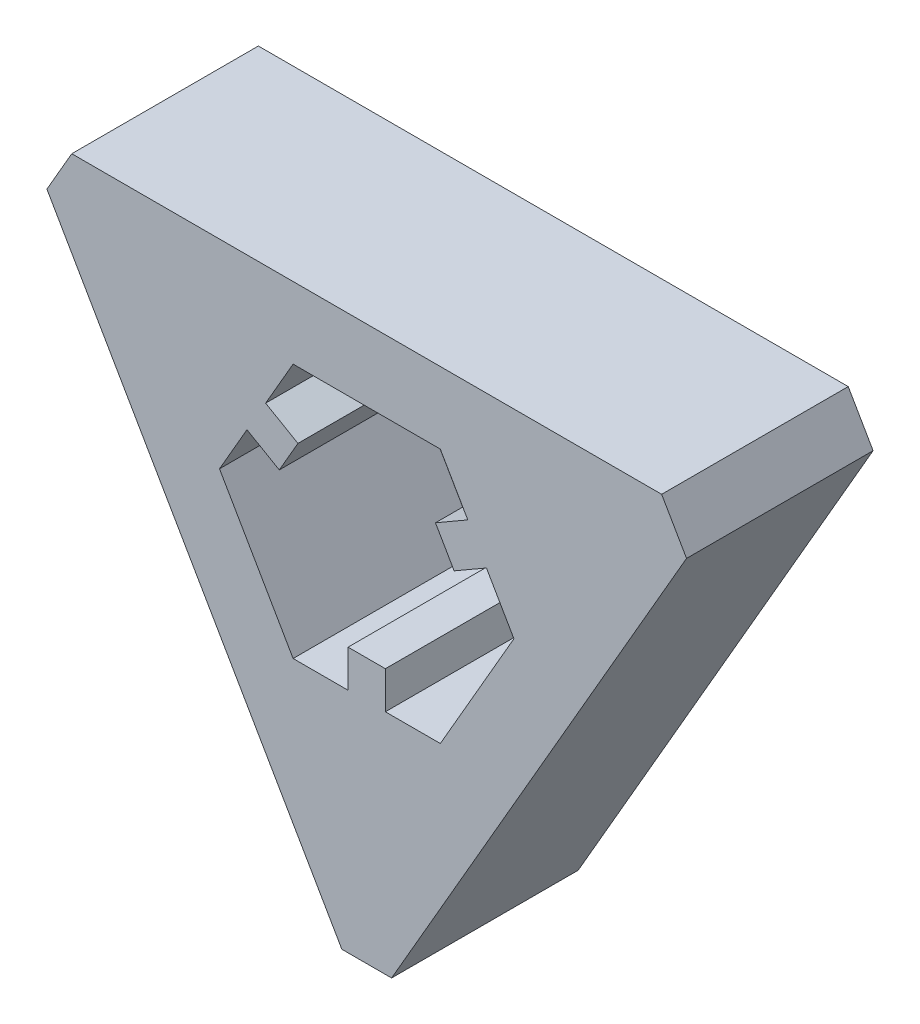
ISO-10303-21;
HEADER;
FILE_DESCRIPTION(('STEP AP214'),'2;1');
FILE_NAME('part.step','',(''),(''),'','','');
FILE_SCHEMA(('AUTOMOTIVE_DESIGN { 1 0 10303 214 1 1 1 1 }'));
ENDSEC;
DATA;
#1=APPLICATION_CONTEXT('core data for automotive mechanical design processes');
#2=APPLICATION_PROTOCOL_DEFINITION('international standard','automotive_design',2000,#1);
#3=PRODUCT_CONTEXT('',#1,'mechanical');
#4=PRODUCT('Part','Part','',(#3));
#5=PRODUCT_RELATED_PRODUCT_CATEGORY('part','',(#4));
#6=PRODUCT_DEFINITION_FORMATION('','',#4);
#7=PRODUCT_DEFINITION_CONTEXT('part definition',#1,'design');
#8=PRODUCT_DEFINITION('design','',#6,#7);
#9=PRODUCT_DEFINITION_SHAPE('','',#8);
#10=(LENGTH_UNIT() NAMED_UNIT(*) SI_UNIT(.MILLI.,.METRE.));
#11=(NAMED_UNIT(*) PLANE_ANGLE_UNIT() SI_UNIT($,.RADIAN.));
#12=(NAMED_UNIT(*) SI_UNIT($,.STERADIAN.) SOLID_ANGLE_UNIT());
#13=UNCERTAINTY_MEASURE_WITH_UNIT(LENGTH_MEASURE(1.E-05),#10,'distance_accuracy_value','');
#14=(GEOMETRIC_REPRESENTATION_CONTEXT(3) GLOBAL_UNCERTAINTY_ASSIGNED_CONTEXT((#13)) GLOBAL_UNIT_ASSIGNED_CONTEXT((#10,
#11,#12)) REPRESENTATION_CONTEXT('',''));
#15=CARTESIAN_POINT('',(0.,0.,0.));
#16=DIRECTION('',(0.,0.,1.));
#17=DIRECTION('',(1.,0.,0.));
#18=AXIS2_PLACEMENT_3D('',#15,#16,#17);
#19=CARTESIAN_POINT('',(0.,0.,-250.));
#20=DIRECTION('',(0.,0.,1.));
#21=DIRECTION('',(1.,0.,0.));
#22=AXIS2_PLACEMENT_3D('',#19,#20,#21);
#23=PLANE('',#22);
#24=DIRECTION('',(-0.500000000000001,-0.866025403784438,0.));
#25=VECTOR('',#24,1.);
#26=CARTESIAN_POINT('',(4.00002711889661,-57.0720970525392,-250.));
#27=LINE('',#26,#25);
#28=CARTESIAN_POINT('',(51.4258100782776,25.0717686218424,-250.));
#29=VERTEX_POINT('',#28);
#30=CARTESIAN_POINT('',(4.00002711889663,-57.0720970525392,-250.));
#31=VERTEX_POINT('',#30);
#32=EDGE_CURVE('E292',#29,#31,#27,.T.);
#33=ORIENTED_EDGE('',*,*,#32,.T.);
#34=DIRECTION('',(-1.,0.,0.));
#35=VECTOR('',#34,1.);
#36=CARTESIAN_POINT('',(4.00002711889663,-57.0720970525392,-250.));
#37=LINE('',#36,#35);
#38=CARTESIAN_POINT('',(-3.99997235196278,-57.0720970525392,-250.));
#39=VERTEX_POINT('',#38);
#40=EDGE_CURVE('E316',#31,#39,#37,.T.);
#41=ORIENTED_EDGE('',*,*,#40,.T.);
#42=DIRECTION('',(-0.5,0.866025403784438,0.));
#43=VECTOR('',#42,1.);
#44=CARTESIAN_POINT('',(-51.4258483825629,25.0719298259231,-250.));
#45=LINE('',#44,#43);
#46=CARTESIAN_POINT('',(-51.4258483825629,25.0719298259231,-250.));
#47=VERTEX_POINT('',#46);
#48=EDGE_CURVE('E295',#39,#47,#45,.T.);
#49=ORIENTED_EDGE('',*,*,#48,.T.);
#50=DIRECTION('',(0.500034807579477,0.866005306686371,0.));
#51=VECTOR('',#50,1.);
#52=CARTESIAN_POINT('',(-51.4258483825629,25.0719298259231,-250.));
#53=LINE('',#52,#51);
#54=CARTESIAN_POINT('',(-47.4255638428803,31.9999828076547,-250.));
#55=VERTEX_POINT('',#54);
#56=EDGE_CURVE('E319',#47,#55,#53,.T.);
#57=ORIENTED_EDGE('',*,*,#56,.T.);
#58=DIRECTION('',(1.,0.,0.));
#59=VECTOR('',#58,1.);
#60=CARTESIAN_POINT('',(47.4258047104851,31.9999828076548,-250.));
#61=LINE('',#60,#59);
#62=CARTESIAN_POINT('',(47.4258047104851,31.9999828076548,-250.));
#63=VERTEX_POINT('',#62);
#64=EDGE_CURVE('E289',#55,#63,#61,.T.);
#65=ORIENTED_EDGE('',*,*,#64,.T.);
#66=DIRECTION('',(0.499999910244853,-0.866025455604591,0.));
#67=VECTOR('',#66,1.);
#68=CARTESIAN_POINT('',(47.4258047104851,31.9999828076548,-250.));
#69=LINE('',#68,#67);
#70=EDGE_CURVE('E314',#63,#29,#69,.T.);
#71=ORIENTED_EDGE('',*,*,#70,.T.);
#72=EDGE_LOOP('',(#33,#41,#49,#57,#65,#71));
#73=FACE_BOUND('',#72,.T.);
#74=DIRECTION('',(-0.5,-0.866025403784439,0.));
#75=VECTOR('',#74,1.);
#76=CARTESIAN_POINT('',(-23.6713610367747,0.,-250.));
#77=LINE('',#76,#75);
#78=CARTESIAN_POINT('',(-11.8356805183874,20.5,-250.));
#79=VERTEX_POINT('',#78);
#80=CARTESIAN_POINT('',(-16.2535207775811,12.8480762113533,-250.));
#81=VERTEX_POINT('',#80);
#82=EDGE_CURVE('E284',#79,#81,#77,.T.);
#83=ORIENTED_EDGE('',*,*,#82,.T.);
#84=DIRECTION('',(0.866025403784442,-0.499999999999995,0.));
#85=VECTOR('',#84,1.);
#86=CARTESIAN_POINT('',(-11.0573683548744,9.84807621135332,-250.));
#87=LINE('',#86,#85);
#88=CARTESIAN_POINT('',(-11.0573683548744,9.84807621135332,-250.));
#89=VERTEX_POINT('',#88);
#90=EDGE_CURVE('E331',#81,#89,#87,.T.);
#91=ORIENTED_EDGE('',*,*,#90,.T.);
#92=DIRECTION('',(-0.499999999999999,-0.866025403784439,0.));
#93=VECTOR('',#92,1.);
#94=CARTESIAN_POINT('',(-14.0573683548744,4.65192378864668,-250.));
#95=LINE('',#94,#93);
#96=CARTESIAN_POINT('',(-14.0573683548744,4.65192378864668,-250.));
#97=VERTEX_POINT('',#96);
#98=EDGE_CURVE('E334',#89,#97,#95,.T.);
#99=ORIENTED_EDGE('',*,*,#98,.T.);
#100=DIRECTION('',(-0.866025403784439,0.499999999999999,0.));
#101=VECTOR('',#100,1.);
#102=CARTESIAN_POINT('',(-19.2535207775811,7.65192378864667,-250.));
#103=LINE('',#102,#101);
#104=CARTESIAN_POINT('',(-19.2535207775811,7.65192378864667,-250.));
#105=VERTEX_POINT('',#104);
#106=EDGE_CURVE('E337',#97,#105,#103,.T.);
#107=ORIENTED_EDGE('',*,*,#106,.T.);
#108=DIRECTION('',(-0.5,-0.866025403784439,0.));
#109=VECTOR('',#108,1.);
#110=CARTESIAN_POINT('',(-23.6713610367747,0.,-250.));
#111=LINE('',#110,#109);
#112=CARTESIAN_POINT('',(-23.6713610367747,0.,-250.));
#113=VERTEX_POINT('',#112);
#114=EDGE_CURVE('E306',#105,#113,#111,.T.);
#115=ORIENTED_EDGE('',*,*,#114,.T.);
#116=DIRECTION('',(0.5,-0.866025403784438,0.));
#117=VECTOR('',#116,1.);
#118=CARTESIAN_POINT('',(-11.8356805183873,-20.5,-250.));
#119=LINE('',#118,#117);
#120=CARTESIAN_POINT('',(-11.8356805183873,-20.5,-250.));
#121=VERTEX_POINT('',#120);
#122=EDGE_CURVE('E303',#113,#121,#119,.T.);
#123=ORIENTED_EDGE('',*,*,#122,.T.);
#124=DIRECTION('',(1.,0.,0.));
#125=VECTOR('',#124,1.);
#126=CARTESIAN_POINT('',(11.8356805183873,-20.5,-250.));
#127=LINE('',#126,#125);
#128=CARTESIAN_POINT('',(-3.,-20.5,-250.));
#129=VERTEX_POINT('',#128);
#130=EDGE_CURVE('E281',#121,#129,#127,.T.);
#131=ORIENTED_EDGE('',*,*,#130,.T.);
#132=DIRECTION('',(0.,1.,0.));
#133=VECTOR('',#132,1.);
#134=CARTESIAN_POINT('',(-3.,-14.5,-250.));
#135=LINE('',#134,#133);
#136=CARTESIAN_POINT('',(-3.,-14.5,-250.));
#137=VERTEX_POINT('',#136);
#138=EDGE_CURVE('E217',#129,#137,#135,.T.);
#139=ORIENTED_EDGE('',*,*,#138,.T.);
#140=DIRECTION('',(1.,0.,0.));
#141=VECTOR('',#140,1.);
#142=CARTESIAN_POINT('',(3.,-14.5,-250.));
#143=LINE('',#142,#141);
#144=CARTESIAN_POINT('',(3.,-14.5,-250.));
#145=VERTEX_POINT('',#144);
#146=EDGE_CURVE('E213',#137,#145,#143,.T.);
#147=ORIENTED_EDGE('',*,*,#146,.T.);
#148=DIRECTION('',(0.,-1.,0.));
#149=VECTOR('',#148,1.);
#150=CARTESIAN_POINT('',(3.,-20.5,-250.));
#151=LINE('',#150,#149);
#152=CARTESIAN_POINT('',(3.,-20.5,-250.));
#153=VERTEX_POINT('',#152);
#154=EDGE_CURVE('E49',#145,#153,#151,.T.);
#155=ORIENTED_EDGE('',*,*,#154,.T.);
#156=DIRECTION('',(1.,0.,0.));
#157=VECTOR('',#156,1.);
#158=CARTESIAN_POINT('',(11.8356805183873,-20.5,-250.));
#159=LINE('',#158,#157);
#160=CARTESIAN_POINT('',(11.8356805183873,-20.5,-250.));
#161=VERTEX_POINT('',#160);
#162=EDGE_CURVE('E301',#153,#161,#159,.T.);
#163=ORIENTED_EDGE('',*,*,#162,.T.);
#164=DIRECTION('',(0.5,0.866025403784439,0.));
#165=VECTOR('',#164,1.);
#166=CARTESIAN_POINT('',(23.6713610367747,0.,-250.));
#167=LINE('',#166,#165);
#168=CARTESIAN_POINT('',(23.6713610367747,0.,-250.));
#169=VERTEX_POINT('',#168);
#170=EDGE_CURVE('E298',#161,#169,#167,.T.);
#171=ORIENTED_EDGE('',*,*,#170,.T.);
#172=DIRECTION('',(-0.5,0.866025403784439,0.));
#173=VECTOR('',#172,1.);
#174=CARTESIAN_POINT('',(11.8356805183873,20.5,-250.));
#175=LINE('',#174,#173);
#176=CARTESIAN_POINT('',(19.253520777581,7.65192378864671,-250.));
#177=VERTEX_POINT('',#176);
#178=EDGE_CURVE('E286',#169,#177,#175,.T.);
#179=ORIENTED_EDGE('',*,*,#178,.T.);
#180=DIRECTION('',(-0.866025403784437,-0.500000000000003,0.));
#181=VECTOR('',#180,1.);
#182=CARTESIAN_POINT('',(14.0573683548744,4.65192378864669,-250.));
#183=LINE('',#182,#181);
#184=CARTESIAN_POINT('',(14.0573683548744,4.65192378864669,-250.));
#185=VERTEX_POINT('',#184);
#186=EDGE_CURVE('E322',#177,#185,#183,.T.);
#187=ORIENTED_EDGE('',*,*,#186,.T.);
#188=DIRECTION('',(-0.500000000000003,0.866025403784437,0.));
#189=VECTOR('',#188,1.);
#190=CARTESIAN_POINT('',(11.0573683548744,9.84807621135332,-250.));
#191=LINE('',#190,#189);
#192=CARTESIAN_POINT('',(11.0573683548744,9.84807621135332,-250.));
#193=VERTEX_POINT('',#192);
#194=EDGE_CURVE('E325',#185,#193,#191,.T.);
#195=ORIENTED_EDGE('',*,*,#194,.T.);
#196=DIRECTION('',(0.86602540378443,0.500000000000016,0.));
#197=VECTOR('',#196,1.);
#198=CARTESIAN_POINT('',(16.2535207775809,12.8480762113534,-250.));
#199=LINE('',#198,#197);
#200=CARTESIAN_POINT('',(16.2535207775809,12.8480762113534,-250.));
#201=VERTEX_POINT('',#200);
#202=EDGE_CURVE('E328',#193,#201,#199,.T.);
#203=ORIENTED_EDGE('',*,*,#202,.T.);
#204=DIRECTION('',(-0.5,0.866025403784439,0.));
#205=VECTOR('',#204,1.);
#206=CARTESIAN_POINT('',(11.8356805183873,20.5,-250.));
#207=LINE('',#206,#205);
#208=CARTESIAN_POINT('',(11.8356805183873,20.5,-250.));
#209=VERTEX_POINT('',#208);
#210=EDGE_CURVE('E311',#201,#209,#207,.T.);
#211=ORIENTED_EDGE('',*,*,#210,.T.);
#212=DIRECTION('',(-1.,0.,0.));
#213=VECTOR('',#212,1.);
#214=CARTESIAN_POINT('',(-11.8356805183874,20.5,-250.));
#215=LINE('',#214,#213);
#216=EDGE_CURVE('E309',#209,#79,#215,.T.);
#217=ORIENTED_EDGE('',*,*,#216,.T.);
#218=EDGE_LOOP('',(#83,#91,#99,#107,#115,#123,#131,#139,#147,#155,#163,#171,#179,#187,#195,#203,
#211,#217));
#219=FACE_BOUND('',#218,.T.);
#220=ADVANCED_FACE('F45',(#73,#219),#23,.F.);
#221=CARTESIAN_POINT('',(0.,0.,-220.));
#222=DIRECTION('',(0.,0.,1.));
#223=DIRECTION('',(1.,0.,0.));
#224=AXIS2_PLACEMENT_3D('',#221,#222,#223);
#225=PLANE('',#224);
#226=DIRECTION('',(-0.5,-0.866025403784439,0.));
#227=VECTOR('',#226,1.);
#228=CARTESIAN_POINT('',(-23.6713610367747,0.,-220.));
#229=LINE('',#228,#227);
#230=CARTESIAN_POINT('',(-11.8356805183874,20.5,-220.));
#231=VERTEX_POINT('',#230);
#232=CARTESIAN_POINT('',(-16.2535207775811,12.8480762113533,-220.));
#233=VERTEX_POINT('',#232);
#234=EDGE_CURVE('E375',#231,#233,#229,.T.);
#235=ORIENTED_EDGE('',*,*,#234,.F.);
#236=DIRECTION('',(-1.,0.,0.));
#237=VECTOR('',#236,1.);
#238=CARTESIAN_POINT('',(-11.8356805183874,20.5,-220.));
#239=LINE('',#238,#237);
#240=CARTESIAN_POINT('',(11.8356805183873,20.5,-220.));
#241=VERTEX_POINT('',#240);
#242=EDGE_CURVE('E401',#241,#231,#239,.T.);
#243=ORIENTED_EDGE('',*,*,#242,.F.);
#244=DIRECTION('',(-0.5,0.866025403784439,0.));
#245=VECTOR('',#244,1.);
#246=CARTESIAN_POINT('',(11.8356805183873,20.5,-220.));
#247=LINE('',#246,#245);
#248=CARTESIAN_POINT('',(16.2535207775809,12.8480762113534,-220.));
#249=VERTEX_POINT('',#248);
#250=EDGE_CURVE('E403',#249,#241,#247,.T.);
#251=ORIENTED_EDGE('',*,*,#250,.F.);
#252=DIRECTION('',(0.86602540378443,0.500000000000016,0.));
#253=VECTOR('',#252,1.);
#254=CARTESIAN_POINT('',(16.2535207775809,12.8480762113534,-220.));
#255=LINE('',#254,#253);
#256=CARTESIAN_POINT('',(11.0573683548744,9.84807621135332,-220.));
#257=VERTEX_POINT('',#256);
#258=EDGE_CURVE('E417',#257,#249,#255,.T.);
#259=ORIENTED_EDGE('',*,*,#258,.F.);
#260=DIRECTION('',(-0.500000000000003,0.866025403784437,0.));
#261=VECTOR('',#260,1.);
#262=CARTESIAN_POINT('',(11.0573683548744,9.84807621135332,-220.));
#263=LINE('',#262,#261);
#264=CARTESIAN_POINT('',(14.0573683548744,4.65192378864669,-220.));
#265=VERTEX_POINT('',#264);
#266=EDGE_CURVE('E414',#265,#257,#263,.T.);
#267=ORIENTED_EDGE('',*,*,#266,.F.);
#268=DIRECTION('',(-0.866025403784437,-0.500000000000003,0.));
#269=VECTOR('',#268,1.);
#270=CARTESIAN_POINT('',(14.0573683548744,4.65192378864669,-220.));
#271=LINE('',#270,#269);
#272=CARTESIAN_POINT('',(19.253520777581,7.65192378864671,-220.));
#273=VERTEX_POINT('',#272);
#274=EDGE_CURVE('E411',#273,#265,#271,.T.);
#275=ORIENTED_EDGE('',*,*,#274,.F.);
#276=DIRECTION('',(-0.5,0.866025403784439,0.));
#277=VECTOR('',#276,1.);
#278=CARTESIAN_POINT('',(11.8356805183873,20.5,-220.));
#279=LINE('',#278,#277);
#280=CARTESIAN_POINT('',(23.6713610367747,0.,-220.));
#281=VERTEX_POINT('',#280);
#282=EDGE_CURVE('E377',#281,#273,#279,.T.);
#283=ORIENTED_EDGE('',*,*,#282,.F.);
#284=DIRECTION('',(0.5,0.866025403784439,0.));
#285=VECTOR('',#284,1.);
#286=CARTESIAN_POINT('',(23.6713610367747,0.,-220.));
#287=LINE('',#286,#285);
#288=CARTESIAN_POINT('',(11.8356805183873,-20.5,-220.));
#289=VERTEX_POINT('',#288);
#290=EDGE_CURVE('E393',#289,#281,#287,.T.);
#291=ORIENTED_EDGE('',*,*,#290,.F.);
#292=DIRECTION('',(1.,0.,0.));
#293=VECTOR('',#292,1.);
#294=CARTESIAN_POINT('',(11.8356805183873,-20.5,-220.));
#295=LINE('',#294,#293);
#296=CARTESIAN_POINT('',(3.,-20.5,-220.));
#297=VERTEX_POINT('',#296);
#298=EDGE_CURVE('E395',#297,#289,#295,.T.);
#299=ORIENTED_EDGE('',*,*,#298,.F.);
#300=DIRECTION('',(0.,-1.,0.));
#301=VECTOR('',#300,1.);
#302=CARTESIAN_POINT('',(3.,-20.5,-220.));
#303=LINE('',#302,#301);
#304=CARTESIAN_POINT('',(3.,-14.5,-220.));
#305=VERTEX_POINT('',#304);
#306=EDGE_CURVE('E62',#305,#297,#303,.T.);
#307=ORIENTED_EDGE('',*,*,#306,.F.);
#308=DIRECTION('',(1.,0.,0.));
#309=VECTOR('',#308,1.);
#310=CARTESIAN_POINT('',(3.,-14.5,-220.));
#311=LINE('',#310,#309);
#312=CARTESIAN_POINT('',(-3.,-14.5,-220.));
#313=VERTEX_POINT('',#312);
#314=EDGE_CURVE('E222',#313,#305,#311,.T.);
#315=ORIENTED_EDGE('',*,*,#314,.F.);
#316=DIRECTION('',(0.,1.,0.));
#317=VECTOR('',#316,1.);
#318=CARTESIAN_POINT('',(-3.,-14.5,-220.));
#319=LINE('',#318,#317);
#320=CARTESIAN_POINT('',(-3.,-20.5,-220.));
#321=VERTEX_POINT('',#320);
#322=EDGE_CURVE('E422',#321,#313,#319,.T.);
#323=ORIENTED_EDGE('',*,*,#322,.F.);
#324=DIRECTION('',(1.,0.,0.));
#325=VECTOR('',#324,1.);
#326=CARTESIAN_POINT('',(11.8356805183873,-20.5,-220.));
#327=LINE('',#326,#325);
#328=CARTESIAN_POINT('',(-11.8356805183873,-20.5,-220.));
#329=VERTEX_POINT('',#328);
#330=EDGE_CURVE('E283',#329,#321,#327,.T.);
#331=ORIENTED_EDGE('',*,*,#330,.F.);
#332=DIRECTION('',(0.5,-0.866025403784438,0.));
#333=VECTOR('',#332,1.);
#334=CARTESIAN_POINT('',(-11.8356805183873,-20.5,-220.));
#335=LINE('',#334,#333);
#336=CARTESIAN_POINT('',(-23.6713610367747,0.,-220.));
#337=VERTEX_POINT('',#336);
#338=EDGE_CURVE('E397',#337,#329,#335,.T.);
#339=ORIENTED_EDGE('',*,*,#338,.F.);
#340=DIRECTION('',(-0.5,-0.866025403784439,0.));
#341=VECTOR('',#340,1.);
#342=CARTESIAN_POINT('',(-23.6713610367747,0.,-220.));
#343=LINE('',#342,#341);
#344=CARTESIAN_POINT('',(-19.2535207775811,7.65192378864667,-220.));
#345=VERTEX_POINT('',#344);
#346=EDGE_CURVE('E399',#345,#337,#343,.T.);
#347=ORIENTED_EDGE('',*,*,#346,.F.);
#348=DIRECTION('',(-0.866025403784439,0.499999999999999,0.));
#349=VECTOR('',#348,1.);
#350=CARTESIAN_POINT('',(-19.2535207775811,7.65192378864667,-220.));
#351=LINE('',#350,#349);
#352=CARTESIAN_POINT('',(-14.0573683548744,4.65192378864668,-220.));
#353=VERTEX_POINT('',#352);
#354=EDGE_CURVE('E347',#353,#345,#351,.T.);
#355=ORIENTED_EDGE('',*,*,#354,.F.);
#356=DIRECTION('',(-0.499999999999999,-0.866025403784439,0.));
#357=VECTOR('',#356,1.);
#358=CARTESIAN_POINT('',(-14.0573683548744,4.65192378864668,-220.));
#359=LINE('',#358,#357);
#360=CARTESIAN_POINT('',(-11.0573683548744,9.84807621135332,-220.));
#361=VERTEX_POINT('',#360);
#362=EDGE_CURVE('E368',#361,#353,#359,.T.);
#363=ORIENTED_EDGE('',*,*,#362,.F.);
#364=DIRECTION('',(0.866025403784442,-0.499999999999995,0.));
#365=VECTOR('',#364,1.);
#366=CARTESIAN_POINT('',(-11.0573683548744,9.84807621135332,-220.));
#367=LINE('',#366,#365);
#368=EDGE_CURVE('E364',#233,#361,#367,.T.);
#369=ORIENTED_EDGE('',*,*,#368,.F.);
#370=EDGE_LOOP('',(#235,#243,#251,#259,#267,#275,#283,#291,#299,#307,#315,#323,#331,#339,#347,
#355,#363,#369));
#371=FACE_BOUND('',#370,.T.);
#372=DIRECTION('',(-0.500000000000001,-0.866025403784438,0.));
#373=VECTOR('',#372,1.);
#374=CARTESIAN_POINT('',(4.00002711889661,-57.0720970525392,-220.));
#375=LINE('',#374,#373);
#376=CARTESIAN_POINT('',(51.4258100782776,25.0717686218424,-220.));
#377=VERTEX_POINT('',#376);
#378=CARTESIAN_POINT('',(4.00002711889663,-57.0720970525392,-220.));
#379=VERTEX_POINT('',#378);
#380=EDGE_CURVE('E387',#377,#379,#375,.T.);
#381=ORIENTED_EDGE('',*,*,#380,.F.);
#382=DIRECTION('',(0.499999910244853,-0.866025455604591,0.));
#383=VECTOR('',#382,1.);
#384=CARTESIAN_POINT('',(47.4258047104851,31.9999828076548,-220.));
#385=LINE('',#384,#383);
#386=CARTESIAN_POINT('',(47.4258047104851,31.9999828076548,-220.));
#387=VERTEX_POINT('',#386);
#388=EDGE_CURVE('E405',#387,#377,#385,.T.);
#389=ORIENTED_EDGE('',*,*,#388,.F.);
#390=DIRECTION('',(1.,0.,0.));
#391=VECTOR('',#390,1.);
#392=CARTESIAN_POINT('',(47.4258047104851,31.9999828076548,-220.));
#393=LINE('',#392,#391);
#394=CARTESIAN_POINT('',(-47.4255638428803,31.9999828076547,-220.));
#395=VERTEX_POINT('',#394);
#396=EDGE_CURVE('E380',#395,#387,#393,.T.);
#397=ORIENTED_EDGE('',*,*,#396,.F.);
#398=DIRECTION('',(0.500034807579477,0.866005306686371,0.));
#399=VECTOR('',#398,1.);
#400=CARTESIAN_POINT('',(-51.4258483825629,25.0719298259231,-220.));
#401=LINE('',#400,#399);
#402=CARTESIAN_POINT('',(-51.4258483825629,25.0719298259231,-220.));
#403=VERTEX_POINT('',#402);
#404=EDGE_CURVE('E409',#403,#395,#401,.T.);
#405=ORIENTED_EDGE('',*,*,#404,.F.);
#406=DIRECTION('',(-0.5,0.866025403784438,0.));
#407=VECTOR('',#406,1.);
#408=CARTESIAN_POINT('',(-51.4258483825629,25.0719298259231,-220.));
#409=LINE('',#408,#407);
#410=CARTESIAN_POINT('',(-3.99997235196278,-57.0720970525392,-220.));
#411=VERTEX_POINT('',#410);
#412=EDGE_CURVE('E390',#411,#403,#409,.T.);
#413=ORIENTED_EDGE('',*,*,#412,.F.);
#414=DIRECTION('',(-1.,0.,0.));
#415=VECTOR('',#414,1.);
#416=CARTESIAN_POINT('',(4.00002711889663,-57.0720970525392,-220.));
#417=LINE('',#416,#415);
#418=EDGE_CURVE('E407',#379,#411,#417,.T.);
#419=ORIENTED_EDGE('',*,*,#418,.F.);
#420=EDGE_LOOP('',(#381,#389,#397,#405,#413,#419));
#421=FACE_BOUND('',#420,.T.);
#422=ADVANCED_FACE('F444',(#371,#421),#225,.T.);
#423=CARTESIAN_POINT('',(23.6713610367747,0.,-140.));
#424=DIRECTION('',(-0.866025403784439,0.5,0.));
#425=DIRECTION('',(0.,0.,1.));
#426=AXIS2_PLACEMENT_3D('',#423,#424,#425);
#427=PLANE('',#426);
#428=ORIENTED_EDGE('',*,*,#170,.F.);
#429=DIRECTION('',(0.,0.,1.));
#430=VECTOR('',#429,1.);
#431=CARTESIAN_POINT('',(11.8356805183873,-20.5,-140.));
#432=LINE('',#431,#430);
#433=EDGE_CURVE('E277',#161,#289,#432,.T.);
#434=ORIENTED_EDGE('',*,*,#433,.T.);
#435=ORIENTED_EDGE('',*,*,#290,.T.);
#436=DIRECTION('',(0.,0.,-1.));
#437=VECTOR('',#436,1.);
#438=CARTESIAN_POINT('',(23.6713610367747,0.,-140.));
#439=LINE('',#438,#437);
#440=EDGE_CURVE('E257',#281,#169,#439,.T.);
#441=ORIENTED_EDGE('',*,*,#440,.T.);
#442=EDGE_LOOP('',(#428,#434,#435,#441));
#443=FACE_BOUND('',#442,.T.);
#444=ADVANCED_FACE('F469',(#443),#427,.T.);
#445=CARTESIAN_POINT('',(11.8356805183873,-20.5,-140.));
#446=DIRECTION('',(0.,1.,0.));
#447=DIRECTION('',(1.,0.,0.));
#448=AXIS2_PLACEMENT_3D('',#445,#446,#447);
#449=PLANE('',#448);
#450=ORIENTED_EDGE('',*,*,#130,.F.);
#451=DIRECTION('',(0.,0.,-1.));
#452=VECTOR('',#451,1.);
#453=CARTESIAN_POINT('',(-11.8356805183873,-20.5,-140.));
#454=LINE('',#453,#452);
#455=EDGE_CURVE('E273',#329,#121,#454,.T.);
#456=ORIENTED_EDGE('',*,*,#455,.F.);
#457=ORIENTED_EDGE('',*,*,#330,.T.);
#458=DIRECTION('',(0.,0.,-1.));
#459=VECTOR('',#458,1.);
#460=CARTESIAN_POINT('',(-3.,-20.5,151.591109915469));
#461=LINE('',#460,#459);
#462=EDGE_CURVE('E227',#321,#129,#461,.T.);
#463=ORIENTED_EDGE('',*,*,#462,.T.);
#464=EDGE_LOOP('',(#450,#456,#457,#463));
#465=FACE_BOUND('',#464,.T.);
#466=ADVANCED_FACE('F474',(#465),#449,.T.);
#467=CARTESIAN_POINT('',(-3.,-14.5,151.591109915469));
#468=DIRECTION('',(-1.,0.,0.));
#469=DIRECTION('',(0.,-1.,0.));
#470=AXIS2_PLACEMENT_3D('',#467,#468,#469);
#471=PLANE('',#470);
#472=ORIENTED_EDGE('',*,*,#138,.F.);
#473=ORIENTED_EDGE('',*,*,#462,.F.);
#474=ORIENTED_EDGE('',*,*,#322,.T.);
#475=DIRECTION('',(0.,0.,-1.));
#476=VECTOR('',#475,1.);
#477=CARTESIAN_POINT('',(-3.,-14.5,151.591109915469));
#478=LINE('',#477,#476);
#479=EDGE_CURVE('E223',#313,#137,#478,.T.);
#480=ORIENTED_EDGE('',*,*,#479,.T.);
#481=EDGE_LOOP('',(#472,#473,#474,#480));
#482=FACE_BOUND('',#481,.T.);
#483=ADVANCED_FACE('F479',(#482),#471,.T.);
#484=ORIENTED_EDGE('',*,*,#162,.F.);
#485=DIRECTION('',(0.,0.,-1.));
#486=VECTOR('',#485,1.);
#487=CARTESIAN_POINT('',(3.,-20.5,151.591109915469));
#488=LINE('',#487,#486);
#489=EDGE_CURVE('E210',#297,#153,#488,.T.);
#490=ORIENTED_EDGE('',*,*,#489,.F.);
#491=ORIENTED_EDGE('',*,*,#298,.T.);
#492=ORIENTED_EDGE('',*,*,#433,.F.);
#493=EDGE_LOOP('',(#484,#490,#491,#492));
#494=FACE_BOUND('',#493,.T.);
#495=ADVANCED_FACE('F476',(#494),#449,.T.);
#496=CARTESIAN_POINT('',(3.,-14.5,151.591109915469));
#497=DIRECTION('',(0.,1.,0.));
#498=DIRECTION('',(0.,0.,1.));
#499=AXIS2_PLACEMENT_3D('',#496,#497,#498);
#500=PLANE('',#499);
#501=ORIENTED_EDGE('',*,*,#146,.F.);
#502=ORIENTED_EDGE('',*,*,#479,.F.);
#503=ORIENTED_EDGE('',*,*,#314,.T.);
#504=DIRECTION('',(0.,0.,-1.));
#505=VECTOR('',#504,1.);
#506=CARTESIAN_POINT('',(3.,-14.5,151.591109915469));
#507=LINE('',#506,#505);
#508=EDGE_CURVE('E208',#305,#145,#507,.T.);
#509=ORIENTED_EDGE('',*,*,#508,.T.);
#510=EDGE_LOOP('',(#501,#502,#503,#509));
#511=FACE_BOUND('',#510,.T.);
#512=ADVANCED_FACE('F221',(#511),#500,.T.);
#513=CARTESIAN_POINT('',(3.,-20.5,151.591109915469));
#514=DIRECTION('',(1.,0.,0.));
#515=DIRECTION('',(0.,1.,0.));
#516=AXIS2_PLACEMENT_3D('',#513,#514,#515);
#517=PLANE('',#516);
#518=ORIENTED_EDGE('',*,*,#154,.F.);
#519=ORIENTED_EDGE('',*,*,#508,.F.);
#520=ORIENTED_EDGE('',*,*,#306,.T.);
#521=ORIENTED_EDGE('',*,*,#489,.T.);
#522=EDGE_LOOP('',(#518,#519,#520,#521));
#523=FACE_BOUND('',#522,.T.);
#524=ADVANCED_FACE('F206',(#523),#517,.T.);
#525=CARTESIAN_POINT('',(-11.8356805183873,-20.5,-140.));
#526=DIRECTION('',(0.866025403784438,0.5,0.));
#527=DIRECTION('',(0.,0.,-1.));
#528=AXIS2_PLACEMENT_3D('',#525,#526,#527);
#529=PLANE('',#528);
#530=ORIENTED_EDGE('',*,*,#122,.F.);
#531=DIRECTION('',(0.,0.,-1.));
#532=VECTOR('',#531,1.);
#533=CARTESIAN_POINT('',(-23.6713610367747,0.,-140.));
#534=LINE('',#533,#532);
#535=EDGE_CURVE('E269',#337,#113,#534,.T.);
#536=ORIENTED_EDGE('',*,*,#535,.F.);
#537=ORIENTED_EDGE('',*,*,#338,.T.);
#538=ORIENTED_EDGE('',*,*,#455,.T.);
#539=EDGE_LOOP('',(#530,#536,#537,#538));
#540=FACE_BOUND('',#539,.T.);
#541=ADVANCED_FACE('F488',(#540),#529,.T.);
#542=CARTESIAN_POINT('',(-23.6713610367747,0.,-140.));
#543=DIRECTION('',(0.866025403784439,-0.5,0.));
#544=DIRECTION('',(0.,0.,-1.));
#545=AXIS2_PLACEMENT_3D('',#542,#543,#544);
#546=PLANE('',#545);
#547=ORIENTED_EDGE('',*,*,#82,.F.);
#548=DIRECTION('',(0.,0.,-1.));
#549=VECTOR('',#548,1.);
#550=CARTESIAN_POINT('',(-11.8356805183874,20.5,-140.));
#551=LINE('',#550,#549);
#552=EDGE_CURVE('E265',#231,#79,#551,.T.);
#553=ORIENTED_EDGE('',*,*,#552,.F.);
#554=ORIENTED_EDGE('',*,*,#234,.T.);
#555=DIRECTION('',(0.,0.,-1.));
#556=VECTOR('',#555,1.);
#557=CARTESIAN_POINT('',(-16.2535207775811,12.8480762113533,151.591109915469));
#558=LINE('',#557,#556);
#559=EDGE_CURVE('E350',#233,#81,#558,.T.);
#560=ORIENTED_EDGE('',*,*,#559,.T.);
#561=EDGE_LOOP('',(#547,#553,#554,#560));
#562=FACE_BOUND('',#561,.T.);
#563=ADVANCED_FACE('F373',(#562),#546,.T.);
#564=CARTESIAN_POINT('',(-11.0573683548744,9.84807621135332,151.591109915469));
#565=DIRECTION('',(0.499999999999995,0.866025403784442,0.));
#566=DIRECTION('',(-0.866025403784442,0.499999999999995,0.));
#567=AXIS2_PLACEMENT_3D('',#564,#565,#566);
#568=PLANE('',#567);
#569=ORIENTED_EDGE('',*,*,#90,.F.);
#570=ORIENTED_EDGE('',*,*,#559,.F.);
#571=ORIENTED_EDGE('',*,*,#368,.T.);
#572=DIRECTION('',(0.,0.,-1.));
#573=VECTOR('',#572,1.);
#574=CARTESIAN_POINT('',(-11.0573683548744,9.84807621135332,151.591109915469));
#575=LINE('',#574,#573);
#576=EDGE_CURVE('E225',#361,#89,#575,.T.);
#577=ORIENTED_EDGE('',*,*,#576,.T.);
#578=EDGE_LOOP('',(#569,#570,#571,#577));
#579=FACE_BOUND('',#578,.T.);
#580=ADVANCED_FACE('F362',(#579),#568,.T.);
#581=ORIENTED_EDGE('',*,*,#114,.F.);
#582=DIRECTION('',(0.,0.,-1.));
#583=VECTOR('',#582,1.);
#584=CARTESIAN_POINT('',(-19.2535207775811,7.65192378864667,151.591109915469));
#585=LINE('',#584,#583);
#586=EDGE_CURVE('E345',#345,#105,#585,.T.);
#587=ORIENTED_EDGE('',*,*,#586,.F.);
#588=ORIENTED_EDGE('',*,*,#346,.T.);
#589=ORIENTED_EDGE('',*,*,#535,.T.);
#590=EDGE_LOOP('',(#581,#587,#588,#589));
#591=FACE_BOUND('',#590,.T.);
#592=ADVANCED_FACE('F492',(#591),#546,.T.);
#593=CARTESIAN_POINT('',(-14.0573683548744,4.65192378864668,151.591109915469));
#594=DIRECTION('',(0.866025403784439,-0.499999999999999,0.));
#595=DIRECTION('',(0.499999999999999,0.866025403784439,0.));
#596=AXIS2_PLACEMENT_3D('',#593,#594,#595);
#597=PLANE('',#596);
#598=ORIENTED_EDGE('',*,*,#98,.F.);
#599=ORIENTED_EDGE('',*,*,#576,.F.);
#600=ORIENTED_EDGE('',*,*,#362,.T.);
#601=DIRECTION('',(0.,0.,-1.));
#602=VECTOR('',#601,1.);
#603=CARTESIAN_POINT('',(-14.0573683548744,4.65192378864668,151.591109915469));
#604=LINE('',#603,#602);
#605=EDGE_CURVE('E351',#353,#97,#604,.T.);
#606=ORIENTED_EDGE('',*,*,#605,.T.);
#607=EDGE_LOOP('',(#598,#599,#600,#606));
#608=FACE_BOUND('',#607,.T.);
#609=ADVANCED_FACE('F367',(#608),#597,.T.);
#610=CARTESIAN_POINT('',(-19.2535207775811,7.65192378864667,151.591109915469));
#611=DIRECTION('',(-0.499999999999999,-0.866025403784439,0.));
#612=DIRECTION('',(0.866025403784439,-0.499999999999999,0.));
#613=AXIS2_PLACEMENT_3D('',#610,#611,#612);
#614=PLANE('',#613);
#615=ORIENTED_EDGE('',*,*,#106,.F.);
#616=ORIENTED_EDGE('',*,*,#605,.F.);
#617=ORIENTED_EDGE('',*,*,#354,.T.);
#618=ORIENTED_EDGE('',*,*,#586,.T.);
#619=EDGE_LOOP('',(#615,#616,#617,#618));
#620=FACE_BOUND('',#619,.T.);
#621=ADVANCED_FACE('F346',(#620),#614,.T.);
#622=CARTESIAN_POINT('',(-11.8356805183874,20.5,-140.));
#623=DIRECTION('',(0.,-1.,0.));
#624=DIRECTION('',(0.,0.,-1.));
#625=AXIS2_PLACEMENT_3D('',#622,#623,#624);
#626=PLANE('',#625);
#627=ORIENTED_EDGE('',*,*,#216,.F.);
#628=DIRECTION('',(0.,0.,-1.));
#629=VECTOR('',#628,1.);
#630=CARTESIAN_POINT('',(11.8356805183873,20.5,-140.));
#631=LINE('',#630,#629);
#632=EDGE_CURVE('E261',#241,#209,#631,.T.);
#633=ORIENTED_EDGE('',*,*,#632,.F.);
#634=ORIENTED_EDGE('',*,*,#242,.T.);
#635=ORIENTED_EDGE('',*,*,#552,.T.);
#636=EDGE_LOOP('',(#627,#633,#634,#635));
#637=FACE_BOUND('',#636,.T.);
#638=ADVANCED_FACE('F454',(#637),#626,.T.);
#639=CARTESIAN_POINT('',(11.8356805183873,20.5,-140.));
#640=DIRECTION('',(-0.866025403784439,-0.5,0.));
#641=DIRECTION('',(-0.5,0.866025403784439,0.));
#642=AXIS2_PLACEMENT_3D('',#639,#640,#641);
#643=PLANE('',#642);
#644=ORIENTED_EDGE('',*,*,#178,.F.);
#645=ORIENTED_EDGE('',*,*,#440,.F.);
#646=ORIENTED_EDGE('',*,*,#282,.T.);
#647=DIRECTION('',(0.,0.,-1.));
#648=VECTOR('',#647,1.);
#649=CARTESIAN_POINT('',(19.253520777581,7.65192378864671,151.591109915469));
#650=LINE('',#649,#648);
#651=EDGE_CURVE('E11',#273,#177,#650,.T.);
#652=ORIENTED_EDGE('',*,*,#651,.T.);
#653=EDGE_LOOP('',(#644,#645,#646,#652));
#654=FACE_BOUND('',#653,.T.);
#655=ADVANCED_FACE('F441',(#654),#643,.T.);
#656=CARTESIAN_POINT('',(14.0573683548744,4.65192378864669,151.591109915469));
#657=DIRECTION('',(0.500000000000003,-0.866025403784437,0.));
#658=DIRECTION('',(0.866025403784437,0.500000000000003,0.));
#659=AXIS2_PLACEMENT_3D('',#656,#657,#658);
#660=PLANE('',#659);
#661=ORIENTED_EDGE('',*,*,#186,.F.);
#662=ORIENTED_EDGE('',*,*,#651,.F.);
#663=ORIENTED_EDGE('',*,*,#274,.T.);
#664=DIRECTION('',(0.,0.,-1.));
#665=VECTOR('',#664,1.);
#666=CARTESIAN_POINT('',(14.0573683548744,4.65192378864669,151.591109915469));
#667=LINE('',#666,#665);
#668=EDGE_CURVE('E354',#265,#185,#667,.T.);
#669=ORIENTED_EDGE('',*,*,#668,.T.);
#670=EDGE_LOOP('',(#661,#662,#663,#669));
#671=FACE_BOUND('',#670,.T.);
#672=ADVANCED_FACE('F434',(#671),#660,.T.);
#673=ORIENTED_EDGE('',*,*,#210,.F.);
#674=DIRECTION('',(0.,0.,-1.));
#675=VECTOR('',#674,1.);
#676=CARTESIAN_POINT('',(16.2535207775809,12.8480762113534,151.591109915469));
#677=LINE('',#676,#675);
#678=EDGE_CURVE('E54',#249,#201,#677,.T.);
#679=ORIENTED_EDGE('',*,*,#678,.F.);
#680=ORIENTED_EDGE('',*,*,#250,.T.);
#681=ORIENTED_EDGE('',*,*,#632,.T.);
#682=EDGE_LOOP('',(#673,#679,#680,#681));
#683=FACE_BOUND('',#682,.T.);
#684=ADVANCED_FACE('F452',(#683),#643,.T.);
#685=CARTESIAN_POINT('',(11.0573683548744,9.84807621135332,151.591109915469));
#686=DIRECTION('',(-0.866025403784437,-0.500000000000003,0.));
#687=DIRECTION('',(0.500000000000003,-0.866025403784437,0.));
#688=AXIS2_PLACEMENT_3D('',#685,#686,#687);
#689=PLANE('',#688);
#690=ORIENTED_EDGE('',*,*,#194,.F.);
#691=ORIENTED_EDGE('',*,*,#668,.F.);
#692=ORIENTED_EDGE('',*,*,#266,.T.);
#693=DIRECTION('',(0.,0.,-1.));
#694=VECTOR('',#693,1.);
#695=CARTESIAN_POINT('',(11.0573683548744,9.84807621135332,151.591109915469));
#696=LINE('',#695,#694);
#697=EDGE_CURVE('E429',#257,#193,#696,.T.);
#698=ORIENTED_EDGE('',*,*,#697,.T.);
#699=EDGE_LOOP('',(#690,#691,#692,#698));
#700=FACE_BOUND('',#699,.T.);
#701=ADVANCED_FACE('F437',(#700),#689,.T.);
#702=CARTESIAN_POINT('',(16.2535207775809,12.8480762113534,151.591109915469));
#703=DIRECTION('',(-0.500000000000015,0.86602540378443,0.));
#704=DIRECTION('',(-0.86602540378443,-0.500000000000016,0.));
#705=AXIS2_PLACEMENT_3D('',#702,#703,#704);
#706=PLANE('',#705);
#707=ORIENTED_EDGE('',*,*,#202,.F.);
#708=ORIENTED_EDGE('',*,*,#697,.F.);
#709=ORIENTED_EDGE('',*,*,#258,.T.);
#710=ORIENTED_EDGE('',*,*,#678,.T.);
#711=EDGE_LOOP('',(#707,#708,#709,#710));
#712=FACE_BOUND('',#711,.T.);
#713=ADVANCED_FACE('F449',(#712),#706,.T.);
#714=CARTESIAN_POINT('',(47.4258047104851,31.9999828076548,0.));
#715=DIRECTION('',(0.,1.,0.));
#716=DIRECTION('',(1.,0.,0.));
#717=AXIS2_PLACEMENT_3D('',#714,#715,#716);
#718=PLANE('',#717);
#719=ORIENTED_EDGE('',*,*,#64,.F.);
#720=DIRECTION('',(0.,0.,-1.));
#721=VECTOR('',#720,1.);
#722=CARTESIAN_POINT('',(-47.4255638428803,31.9999828076547,-140.));
#723=LINE('',#722,#721);
#724=EDGE_CURVE('E233',#395,#55,#723,.T.);
#725=ORIENTED_EDGE('',*,*,#724,.F.);
#726=ORIENTED_EDGE('',*,*,#396,.T.);
#727=DIRECTION('',(0.,0.,-1.));
#728=VECTOR('',#727,1.);
#729=CARTESIAN_POINT('',(47.4258047104851,31.9999828076548,-140.));
#730=LINE('',#729,#728);
#731=EDGE_CURVE('E253',#387,#63,#730,.T.);
#732=ORIENTED_EDGE('',*,*,#731,.T.);
#733=EDGE_LOOP('',(#719,#725,#726,#732));
#734=FACE_BOUND('',#733,.T.);
#735=ADVANCED_FACE('F556',(#734),#718,.T.);
#736=CARTESIAN_POINT('',(-51.4258483825629,25.0719298259231,0.));
#737=DIRECTION('',(-0.866025403784438,-0.5,0.));
#738=DIRECTION('',(-0.5,0.866025403784438,0.));
#739=AXIS2_PLACEMENT_3D('',#736,#737,#738);
#740=PLANE('',#739);
#741=ORIENTED_EDGE('',*,*,#48,.F.);
#742=DIRECTION('',(0.,0.,-1.));
#743=VECTOR('',#742,1.);
#744=CARTESIAN_POINT('',(-3.99997235196278,-57.0720970525392,-140.));
#745=LINE('',#744,#743);
#746=EDGE_CURVE('E241',#411,#39,#745,.T.);
#747=ORIENTED_EDGE('',*,*,#746,.F.);
#748=ORIENTED_EDGE('',*,*,#412,.T.);
#749=DIRECTION('',(0.,0.,-1.));
#750=VECTOR('',#749,1.);
#751=CARTESIAN_POINT('',(-51.4258483825629,25.0719298259231,-140.));
#752=LINE('',#751,#750);
#753=EDGE_CURVE('E237',#403,#47,#752,.T.);
#754=ORIENTED_EDGE('',*,*,#753,.T.);
#755=EDGE_LOOP('',(#741,#747,#748,#754));
#756=FACE_BOUND('',#755,.T.);
#757=ADVANCED_FACE('F565',(#756),#740,.T.);
#758=CARTESIAN_POINT('',(-51.4258483825629,25.0719298259231,-140.));
#759=DIRECTION('',(-0.866005306686371,0.500034807579477,0.));
#760=DIRECTION('',(0.,0.,1.));
#761=AXIS2_PLACEMENT_3D('',#758,#759,#760);
#762=PLANE('',#761);
#763=ORIENTED_EDGE('',*,*,#56,.F.);
#764=ORIENTED_EDGE('',*,*,#753,.F.);
#765=ORIENTED_EDGE('',*,*,#404,.T.);
#766=ORIENTED_EDGE('',*,*,#724,.T.);
#767=EDGE_LOOP('',(#763,#764,#765,#766));
#768=FACE_BOUND('',#767,.T.);
#769=ADVANCED_FACE('F576',(#768),#762,.T.);
#770=CARTESIAN_POINT('',(4.00002711889661,-57.0720970525392,0.));
#771=DIRECTION('',(0.866025403784437,-0.5,0.));
#772=DIRECTION('',(0.,0.,-1.));
#773=AXIS2_PLACEMENT_3D('',#770,#771,#772);
#774=PLANE('',#773);
#775=ORIENTED_EDGE('',*,*,#32,.F.);
#776=DIRECTION('',(0.,0.,-1.));
#777=VECTOR('',#776,1.);
#778=CARTESIAN_POINT('',(51.4258100782776,25.0717686218424,-140.));
#779=LINE('',#778,#777);
#780=EDGE_CURVE('E249',#377,#29,#779,.T.);
#781=ORIENTED_EDGE('',*,*,#780,.F.);
#782=ORIENTED_EDGE('',*,*,#380,.T.);
#783=DIRECTION('',(0.,0.,-1.));
#784=VECTOR('',#783,1.);
#785=CARTESIAN_POINT('',(4.00002711889663,-57.0720970525392,-140.));
#786=LINE('',#785,#784);
#787=EDGE_CURVE('E245',#379,#31,#786,.T.);
#788=ORIENTED_EDGE('',*,*,#787,.T.);
#789=EDGE_LOOP('',(#775,#781,#782,#788));
#790=FACE_BOUND('',#789,.T.);
#791=ADVANCED_FACE('F587',(#790),#774,.T.);
#792=CARTESIAN_POINT('',(4.00002711889663,-57.0720970525392,-140.));
#793=DIRECTION('',(0.,-1.,0.));
#794=DIRECTION('',(0.,0.,-1.));
#795=AXIS2_PLACEMENT_3D('',#792,#793,#794);
#796=PLANE('',#795);
#797=ORIENTED_EDGE('',*,*,#40,.F.);
#798=ORIENTED_EDGE('',*,*,#787,.F.);
#799=ORIENTED_EDGE('',*,*,#418,.T.);
#800=ORIENTED_EDGE('',*,*,#746,.T.);
#801=EDGE_LOOP('',(#797,#798,#799,#800));
#802=FACE_BOUND('',#801,.T.);
#803=ADVANCED_FACE('F598',(#802),#796,.T.);
#804=CARTESIAN_POINT('',(47.4258047104851,31.9999828076548,-140.));
#805=DIRECTION('',(0.866025455604591,0.499999910244853,0.));
#806=DIRECTION('',(0.,0.,-1.));
#807=AXIS2_PLACEMENT_3D('',#804,#805,#806);
#808=PLANE('',#807);
#809=ORIENTED_EDGE('',*,*,#70,.F.);
#810=ORIENTED_EDGE('',*,*,#731,.F.);
#811=ORIENTED_EDGE('',*,*,#388,.T.);
#812=ORIENTED_EDGE('',*,*,#780,.T.);
#813=EDGE_LOOP('',(#809,#810,#811,#812));
#814=FACE_BOUND('',#813,.T.);
#815=ADVANCED_FACE('F47',(#814),#808,.T.);
#816=CLOSED_SHELL('',(#220,#422,#444,#466,#483,#495,#512,#524,#541,#563,#580,#592,#609,#621,
#638,#655,#672,#684,#701,#713,#735,#757,#769,#791,#803,#815));
#817=MANIFOLD_SOLID_BREP('B2',#816);
#818=ADVANCED_BREP_SHAPE_REPRESENTATION('',(#18,#817),#14);
#819=SHAPE_DEFINITION_REPRESENTATION(#9,#818);
ENDSEC;
END-ISO-10303-21;
